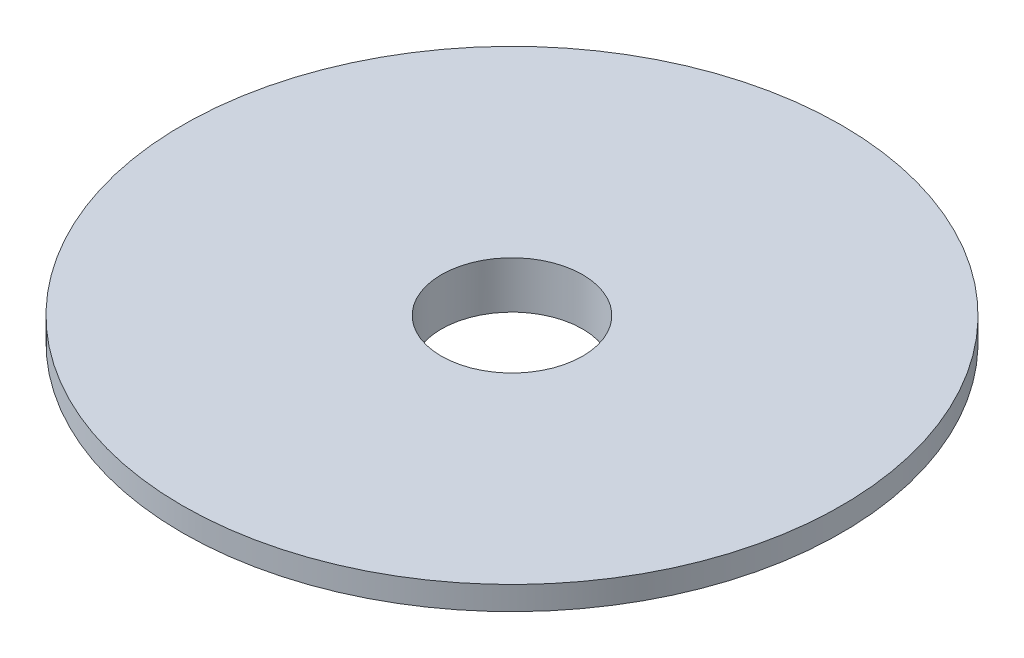
ISO-10303-21;
HEADER;
FILE_DESCRIPTION(('STEP AP214'),'2;1');
FILE_NAME('part.step','',(''),(''),'','','');
FILE_SCHEMA(('AUTOMOTIVE_DESIGN { 1 0 10303 214 1 1 1 1 }'));
ENDSEC;
DATA;
#1=APPLICATION_CONTEXT('core data for automotive mechanical design processes');
#2=APPLICATION_PROTOCOL_DEFINITION('international standard','automotive_design',2000,#1);
#3=PRODUCT_CONTEXT('',#1,'mechanical');
#4=PRODUCT('Part','Part','',(#3));
#5=PRODUCT_RELATED_PRODUCT_CATEGORY('part','',(#4));
#6=PRODUCT_DEFINITION_FORMATION('','',#4);
#7=PRODUCT_DEFINITION_CONTEXT('part definition',#1,'design');
#8=PRODUCT_DEFINITION('design','',#6,#7);
#9=PRODUCT_DEFINITION_SHAPE('','',#8);
#10=(LENGTH_UNIT() NAMED_UNIT(*) SI_UNIT(.MILLI.,.METRE.));
#11=(NAMED_UNIT(*) PLANE_ANGLE_UNIT() SI_UNIT($,.RADIAN.));
#12=(NAMED_UNIT(*) SI_UNIT($,.STERADIAN.) SOLID_ANGLE_UNIT());
#13=UNCERTAINTY_MEASURE_WITH_UNIT(LENGTH_MEASURE(1.E-05),#10,'distance_accuracy_value','');
#14=(GEOMETRIC_REPRESENTATION_CONTEXT(3) GLOBAL_UNCERTAINTY_ASSIGNED_CONTEXT((#13)) GLOBAL_UNIT_ASSIGNED_CONTEXT((#10,
#11,#12)) REPRESENTATION_CONTEXT('',''));
#15=CARTESIAN_POINT('',(0.,0.,0.));
#16=DIRECTION('',(0.,0.,1.));
#17=DIRECTION('',(1.,0.,0.));
#18=AXIS2_PLACEMENT_3D('',#15,#16,#17);
#19=CARTESIAN_POINT('',(0.,0.,0.));
#20=DIRECTION('',(0.,1.,0.));
#21=DIRECTION('',(0.,0.,1.));
#22=AXIS2_PLACEMENT_3D('',#19,#20,#21);
#23=PLANE('',#22);
#24=CARTESIAN_POINT('',(0.,0.,0.));
#25=DIRECTION('',(0.,1.,0.));
#26=DIRECTION('',(0.,0.,1.));
#27=AXIS2_PLACEMENT_3D('',#24,#25,#26);
#28=CIRCLE('',#27,88.9);
#29=CARTESIAN_POINT('',(0.,0.,88.9));
#30=VERTEX_POINT('',#29);
#31=EDGE_CURVE('E43',#30,#30,#28,.T.);
#32=ORIENTED_EDGE('',*,*,#31,.F.);
#33=EDGE_LOOP('',(#32));
#34=FACE_BOUND('',#33,.T.);
#35=CARTESIAN_POINT('',(0.,0.,0.));
#36=DIRECTION('',(0.,1.,0.));
#37=DIRECTION('',(0.,0.,1.));
#38=AXIS2_PLACEMENT_3D('',#35,#36,#37);
#39=CIRCLE('',#38,25.4);
#40=CARTESIAN_POINT('',(0.,0.,25.4));
#41=VERTEX_POINT('',#40);
#42=EDGE_CURVE('E10',#41,#41,#39,.F.);
#43=ORIENTED_EDGE('',*,*,#42,.F.);
#44=EDGE_LOOP('',(#43));
#45=FACE_BOUND('',#44,.T.);
#46=ADVANCED_FACE('F32',(#34,#45),#23,.F.);
#47=CARTESIAN_POINT('',(0.,6.35,0.));
#48=DIRECTION('',(0.,1.,0.));
#49=DIRECTION('',(0.,0.,1.));
#50=AXIS2_PLACEMENT_3D('',#47,#48,#49);
#51=PLANE('',#50);
#52=CARTESIAN_POINT('',(0.,6.35,0.));
#53=DIRECTION('',(0.,1.,0.));
#54=DIRECTION('',(0.,0.,1.));
#55=AXIS2_PLACEMENT_3D('',#52,#53,#54);
#56=CIRCLE('',#55,88.9);
#57=CARTESIAN_POINT('',(0.,6.35,88.9));
#58=VERTEX_POINT('',#57);
#59=EDGE_CURVE('E39',#58,#58,#56,.T.);
#60=ORIENTED_EDGE('',*,*,#59,.T.);
#61=EDGE_LOOP('',(#60));
#62=FACE_BOUND('',#61,.T.);
#63=CARTESIAN_POINT('',(0.,6.35,0.));
#64=DIRECTION('',(0.,1.,0.));
#65=DIRECTION('',(0.,0.,1.));
#66=AXIS2_PLACEMENT_3D('',#63,#64,#65);
#67=CIRCLE('',#66,19.05);
#68=CARTESIAN_POINT('',(0.,6.35,19.05));
#69=VERTEX_POINT('',#68);
#70=EDGE_CURVE('E48',#69,#69,#67,.T.);
#71=ORIENTED_EDGE('',*,*,#70,.F.);
#72=EDGE_LOOP('',(#71));
#73=FACE_BOUND('',#72,.T.);
#74=ADVANCED_FACE('F75',(#62,#73),#51,.T.);
#75=CARTESIAN_POINT('',(0.,6.35,0.));
#76=DIRECTION('',(0.,-1.,0.));
#77=DIRECTION('',(0.,0.,-1.));
#78=AXIS2_PLACEMENT_3D('',#75,#76,#77);
#79=CYLINDRICAL_SURFACE('',#78,88.9);
#80=ORIENTED_EDGE('',*,*,#59,.F.);
#81=EDGE_LOOP('',(#80));
#82=FACE_BOUND('',#81,.T.);
#83=ORIENTED_EDGE('',*,*,#31,.T.);
#84=EDGE_LOOP('',(#83));
#85=FACE_BOUND('',#84,.T.);
#86=ADVANCED_FACE('F34',(#82,#85),#79,.T.);
#87=CARTESIAN_POINT('',(0.,6.35,0.));
#88=DIRECTION('',(0.,-1.,0.));
#89=DIRECTION('',(0.,0.,-1.));
#90=AXIS2_PLACEMENT_3D('',#87,#88,#89);
#91=CYLINDRICAL_SURFACE('',#90,19.05);
#92=ORIENTED_EDGE('',*,*,#70,.T.);
#93=EDGE_LOOP('',(#92));
#94=FACE_BOUND('',#93,.T.);
#95=CARTESIAN_POINT('',(0.,-6.35,0.));
#96=DIRECTION('',(0.,-1.,0.));
#97=DIRECTION('',(0.,0.,-1.));
#98=AXIS2_PLACEMENT_3D('',#95,#96,#97);
#99=CIRCLE('',#98,19.05);
#100=CARTESIAN_POINT('',(0.,-6.35,-19.05));
#101=VERTEX_POINT('',#100);
#102=EDGE_CURVE('E55',#101,#101,#99,.T.);
#103=ORIENTED_EDGE('',*,*,#102,.T.);
#104=EDGE_LOOP('',(#103));
#105=FACE_BOUND('',#104,.T.);
#106=ADVANCED_FACE('F59',(#94,#105),#91,.F.);
#107=CARTESIAN_POINT('',(0.,-6.35,0.));
#108=DIRECTION('',(0.,-1.,0.));
#109=DIRECTION('',(0.,0.,-1.));
#110=AXIS2_PLACEMENT_3D('',#107,#108,#109);
#111=PLANE('',#110);
#112=CARTESIAN_POINT('',(0.,-6.35,0.));
#113=DIRECTION('',(0.,-1.,0.));
#114=DIRECTION('',(0.,0.,-1.));
#115=AXIS2_PLACEMENT_3D('',#112,#113,#114);
#116=CIRCLE('',#115,25.4);
#117=CARTESIAN_POINT('',(0.,-6.35,-25.4));
#118=VERTEX_POINT('',#117);
#119=EDGE_CURVE('E52',#118,#118,#116,.T.);
#120=ORIENTED_EDGE('',*,*,#119,.T.);
#121=EDGE_LOOP('',(#120));
#122=FACE_BOUND('',#121,.T.);
#123=ORIENTED_EDGE('',*,*,#102,.F.);
#124=EDGE_LOOP('',(#123));
#125=FACE_BOUND('',#124,.T.);
#126=ADVANCED_FACE('F61',(#122,#125),#111,.T.);
#127=CARTESIAN_POINT('',(0.,-6.35,0.));
#128=DIRECTION('',(0.,1.,0.));
#129=DIRECTION('',(0.,0.,1.));
#130=AXIS2_PLACEMENT_3D('',#127,#128,#129);
#131=CYLINDRICAL_SURFACE('',#130,25.4);
#132=ORIENTED_EDGE('',*,*,#119,.F.);
#133=EDGE_LOOP('',(#132));
#134=FACE_BOUND('',#133,.T.);
#135=ORIENTED_EDGE('',*,*,#42,.T.);
#136=EDGE_LOOP('',(#135));
#137=FACE_BOUND('',#136,.T.);
#138=ADVANCED_FACE('F63',(#134,#137),#131,.T.);
#139=CLOSED_SHELL('',(#46,#74,#86,#106,#126,#138));
#140=MANIFOLD_SOLID_BREP('B2',#139);
#141=ADVANCED_BREP_SHAPE_REPRESENTATION('',(#18,#140),#14);
#142=SHAPE_DEFINITION_REPRESENTATION(#9,#141);
ENDSEC;
END-ISO-10303-21;
